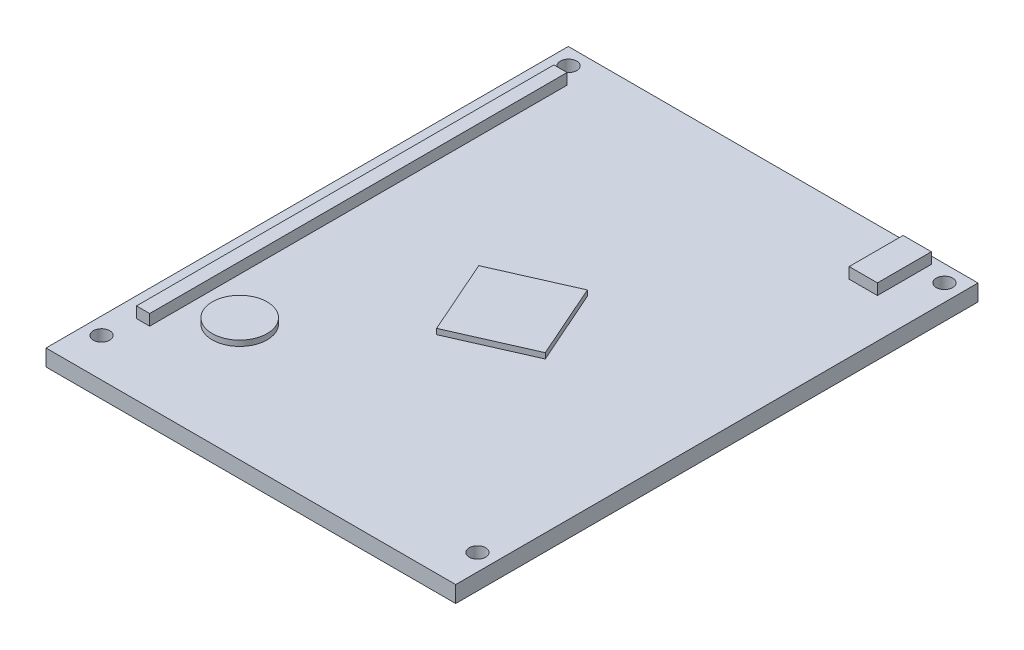
ISO-10303-21;
HEADER;
FILE_DESCRIPTION(('STEP AP214'),'2;1');
FILE_NAME('part.step','',(''),(''),'','','');
FILE_SCHEMA(('AUTOMOTIVE_DESIGN { 1 0 10303 214 1 1 1 1 }'));
ENDSEC;
DATA;
#1=APPLICATION_CONTEXT('core data for automotive mechanical design processes');
#2=APPLICATION_PROTOCOL_DEFINITION('international standard','automotive_design',2000,#1);
#3=PRODUCT_CONTEXT('',#1,'mechanical');
#4=PRODUCT('Part','Part','',(#3));
#5=PRODUCT_RELATED_PRODUCT_CATEGORY('part','',(#4));
#6=PRODUCT_DEFINITION_FORMATION('','',#4);
#7=PRODUCT_DEFINITION_CONTEXT('part definition',#1,'design');
#8=PRODUCT_DEFINITION('design','',#6,#7);
#9=PRODUCT_DEFINITION_SHAPE('','',#8);
#10=(LENGTH_UNIT() NAMED_UNIT(*) SI_UNIT(.MILLI.,.METRE.));
#11=(NAMED_UNIT(*) PLANE_ANGLE_UNIT() SI_UNIT($,.RADIAN.));
#12=(NAMED_UNIT(*) SI_UNIT($,.STERADIAN.) SOLID_ANGLE_UNIT());
#13=UNCERTAINTY_MEASURE_WITH_UNIT(LENGTH_MEASURE(1.E-05),#10,'distance_accuracy_value','');
#14=(GEOMETRIC_REPRESENTATION_CONTEXT(3) GLOBAL_UNCERTAINTY_ASSIGNED_CONTEXT((#13)) GLOBAL_UNIT_ASSIGNED_CONTEXT((#10,
#11,#12)) REPRESENTATION_CONTEXT('',''));
#15=CARTESIAN_POINT('',(0.,0.,0.));
#16=DIRECTION('',(0.,0.,1.));
#17=DIRECTION('',(1.,0.,0.));
#18=AXIS2_PLACEMENT_3D('',#15,#16,#17);
#19=CARTESIAN_POINT('',(0.,3.,0.));
#20=DIRECTION('',(0.,1.,0.));
#21=DIRECTION('',(0.,0.,1.));
#22=AXIS2_PLACEMENT_3D('',#19,#20,#21);
#23=PLANE('',#22);
#24=DIRECTION('',(-1.,0.,0.));
#25=VECTOR('',#24,1.);
#26=CARTESIAN_POINT('',(-33.7,3.,-41.3254575956985));
#27=LINE('',#26,#25);
#28=CARTESIAN_POINT('',(-31.3,3.,-41.3254575956985));
#29=VERTEX_POINT('',#28);
#30=CARTESIAN_POINT('',(-33.7,3.,-41.3254575956985));
#31=VERTEX_POINT('',#30);
#32=EDGE_CURVE('E177',#29,#31,#27,.T.);
#33=ORIENTED_EDGE('',*,*,#32,.F.);
#34=DIRECTION('',(0.,0.,-1.));
#35=VECTOR('',#34,1.);
#36=CARTESIAN_POINT('',(-31.3,3.,-41.3254575956985));
#37=LINE('',#36,#35);
#38=CARTESIAN_POINT('',(-31.3,3.,34.6745424043015));
#39=VERTEX_POINT('',#38);
#40=EDGE_CURVE('E174',#39,#29,#37,.T.);
#41=ORIENTED_EDGE('',*,*,#40,.F.);
#42=DIRECTION('',(1.,0.,0.));
#43=VECTOR('',#42,1.);
#44=CARTESIAN_POINT('',(-33.7,3.,34.6745424043015));
#45=LINE('',#44,#43);
#46=CARTESIAN_POINT('',(-33.7,3.,34.6745424043015));
#47=VERTEX_POINT('',#46);
#48=EDGE_CURVE('E186',#47,#39,#45,.T.);
#49=ORIENTED_EDGE('',*,*,#48,.F.);
#50=DIRECTION('',(0.,0.,1.));
#51=VECTOR('',#50,1.);
#52=CARTESIAN_POINT('',(-33.7,3.,-41.3254575956985));
#53=LINE('',#52,#51);
#54=EDGE_CURVE('E194',#31,#47,#53,.T.);
#55=ORIENTED_EDGE('',*,*,#54,.F.);
#56=EDGE_LOOP('',(#33,#41,#49,#55));
#57=FACE_BOUND('',#56,.T.);
#58=DIRECTION('',(0.40369535597845,0.,0.914893468968618));
#59=VECTOR('',#58,1.);
#60=CARTESIAN_POINT('',(-9.88941618710301,3.,-3.83398584742626));
#61=LINE('',#60,#59);
#62=CARTESIAN_POINT('',(-9.88941618710301,3.,-3.83398584742626));
#63=VERTEX_POINT('',#62);
#64=CARTESIAN_POINT('',(-3.83398584742626,3.,9.88941618710302));
#65=VERTEX_POINT('',#64);
#66=EDGE_CURVE('E225',#63,#65,#61,.T.);
#67=ORIENTED_EDGE('',*,*,#66,.F.);
#68=DIRECTION('',(-0.914893468968618,0.,0.40369535597845));
#69=VECTOR('',#68,1.);
#70=CARTESIAN_POINT('',(-9.88941618710301,3.,-3.83398584742626));
#71=LINE('',#70,#69);
#72=CARTESIAN_POINT('',(3.83398584742626,3.,-9.88941618710301));
#73=VERTEX_POINT('',#72);
#74=EDGE_CURVE('E209',#73,#63,#71,.T.);
#75=ORIENTED_EDGE('',*,*,#74,.F.);
#76=DIRECTION('',(-0.40369535597845,0.,-0.914893468968618));
#77=VECTOR('',#76,1.);
#78=CARTESIAN_POINT('',(3.83398584742626,3.,-9.88941618710301));
#79=LINE('',#78,#77);
#80=CARTESIAN_POINT('',(9.88941618710301,3.,3.83398584742626));
#81=VERTEX_POINT('',#80);
#82=EDGE_CURVE('E216',#81,#73,#79,.T.);
#83=ORIENTED_EDGE('',*,*,#82,.F.);
#84=DIRECTION('',(0.914893468968618,0.,-0.40369535597845));
#85=VECTOR('',#84,1.);
#86=CARTESIAN_POINT('',(-3.83398584742626,3.,9.88941618710302));
#87=LINE('',#86,#85);
#88=EDGE_CURVE('E227',#65,#81,#87,.T.);
#89=ORIENTED_EDGE('',*,*,#88,.F.);
#90=EDGE_LOOP('',(#67,#75,#83,#89));
#91=FACE_BOUND('',#90,.T.);
#92=CARTESIAN_POINT('',(34.225,3.,-44.515));
#93=DIRECTION('',(0.,1.,0.));
#94=DIRECTION('',(0.,0.,1.));
#95=AXIS2_PLACEMENT_3D('',#92,#93,#94);
#96=CIRCLE('',#95,1.5);
#97=CARTESIAN_POINT('',(34.225,3.,-43.015));
#98=VERTEX_POINT('',#97);
#99=EDGE_CURVE('E247',#98,#98,#96,.T.);
#100=ORIENTED_EDGE('',*,*,#99,.F.);
#101=EDGE_LOOP('',(#100));
#102=FACE_BOUND('',#101,.T.);
#103=CARTESIAN_POINT('',(-34.225,3.,40.515));
#104=DIRECTION('',(0.,1.,0.));
#105=DIRECTION('',(0.,0.,1.));
#106=AXIS2_PLACEMENT_3D('',#103,#104,#105);
#107=CIRCLE('',#106,1.5);
#108=CARTESIAN_POINT('',(-34.225,3.,42.015));
#109=VERTEX_POINT('',#108);
#110=EDGE_CURVE('E259',#109,#109,#107,.T.);
#111=ORIENTED_EDGE('',*,*,#110,.F.);
#112=EDGE_LOOP('',(#111));
#113=FACE_BOUND('',#112,.T.);
#114=DIRECTION('',(0.,0.,-1.));
#115=VECTOR('',#114,1.);
#116=CARTESIAN_POINT('',(37.3,3.,-47.55));
#117=LINE('',#116,#115);
#118=CARTESIAN_POINT('',(37.3,3.,47.55));
#119=VERTEX_POINT('',#118);
#120=CARTESIAN_POINT('',(37.3,3.,-47.55));
#121=VERTEX_POINT('',#120);
#122=EDGE_CURVE('E265',#119,#121,#117,.T.);
#123=ORIENTED_EDGE('',*,*,#122,.T.);
#124=DIRECTION('',(-1.,0.,0.));
#125=VECTOR('',#124,1.);
#126=CARTESIAN_POINT('',(-37.3,3.,-47.55));
#127=LINE('',#126,#125);
#128=CARTESIAN_POINT('',(-37.3,3.,-47.55));
#129=VERTEX_POINT('',#128);
#130=EDGE_CURVE('E268',#121,#129,#127,.T.);
#131=ORIENTED_EDGE('',*,*,#130,.T.);
#132=DIRECTION('',(0.,0.,1.));
#133=VECTOR('',#132,1.);
#134=CARTESIAN_POINT('',(-37.3,3.,-47.55));
#135=LINE('',#134,#133);
#136=CARTESIAN_POINT('',(-37.3,3.,47.55));
#137=VERTEX_POINT('',#136);
#138=EDGE_CURVE('E271',#129,#137,#135,.T.);
#139=ORIENTED_EDGE('',*,*,#138,.T.);
#140=DIRECTION('',(1.,0.,0.));
#141=VECTOR('',#140,1.);
#142=CARTESIAN_POINT('',(-37.3,3.,47.55));
#143=LINE('',#142,#141);
#144=EDGE_CURVE('E273',#137,#119,#143,.T.);
#145=ORIENTED_EDGE('',*,*,#144,.T.);
#146=EDGE_LOOP('',(#123,#131,#139,#145));
#147=FACE_BOUND('',#146,.T.);
#148=CARTESIAN_POINT('',(-34.225,3.,-44.515));
#149=DIRECTION('',(0.,1.,0.));
#150=DIRECTION('',(0.,0.,1.));
#151=AXIS2_PLACEMENT_3D('',#148,#149,#150);
#152=CIRCLE('',#151,1.5);
#153=CARTESIAN_POINT('',(-34.225,3.,-43.015));
#154=VERTEX_POINT('',#153);
#155=EDGE_CURVE('E253',#154,#154,#152,.T.);
#156=ORIENTED_EDGE('',*,*,#155,.F.);
#157=EDGE_LOOP('',(#156));
#158=FACE_BOUND('',#157,.T.);
#159=CARTESIAN_POINT('',(34.225,3.,40.515));
#160=DIRECTION('',(0.,1.,0.));
#161=DIRECTION('',(0.,0.,1.));
#162=AXIS2_PLACEMENT_3D('',#159,#160,#161);
#163=CIRCLE('',#162,1.5);
#164=CARTESIAN_POINT('',(34.225,3.,42.015));
#165=VERTEX_POINT('',#164);
#166=EDGE_CURVE('E241',#165,#165,#163,.T.);
#167=ORIENTED_EDGE('',*,*,#166,.F.);
#168=EDGE_LOOP('',(#167));
#169=FACE_BOUND('',#168,.T.);
#170=CARTESIAN_POINT('',(-23.4406590913058,3.,26.1402855596865));
#171=DIRECTION('',(0.,1.,0.));
#172=DIRECTION('',(0.,0.,1.));
#173=AXIS2_PLACEMENT_3D('',#170,#171,#172);
#174=CIRCLE('',#173,5.);
#175=CARTESIAN_POINT('',(-23.4406590913058,3.,31.1402855596865));
#176=VERTEX_POINT('',#175);
#177=EDGE_CURVE('E205',#176,#176,#174,.T.);
#178=ORIENTED_EDGE('',*,*,#177,.F.);
#179=EDGE_LOOP('',(#178));
#180=FACE_BOUND('',#179,.T.);
#181=DIRECTION('',(-1.,0.,0.));
#182=VECTOR('',#181,1.);
#183=CARTESIAN_POINT('',(24.9785951751988,3.,-46.2356199731953));
#184=LINE('',#183,#182);
#185=CARTESIAN_POINT('',(30.1215528838341,3.,-46.2356199731953));
#186=VERTEX_POINT('',#185);
#187=CARTESIAN_POINT('',(24.9785951751988,3.,-46.2356199731953));
#188=VERTEX_POINT('',#187);
#189=EDGE_CURVE('E575',#186,#188,#184,.T.);
#190=ORIENTED_EDGE('',*,*,#189,.F.);
#191=DIRECTION('',(0.,0.,-1.));
#192=VECTOR('',#191,1.);
#193=CARTESIAN_POINT('',(30.1215528838341,3.,-46.2356199731953));
#194=LINE('',#193,#192);
#195=CARTESIAN_POINT('',(30.1215528838341,3.,-36.4152952182017));
#196=VERTEX_POINT('',#195);
#197=EDGE_CURVE('E172',#196,#186,#194,.T.);
#198=ORIENTED_EDGE('',*,*,#197,.F.);
#199=DIRECTION('',(1.,0.,0.));
#200=VECTOR('',#199,1.);
#201=CARTESIAN_POINT('',(24.9785951751988,3.,-36.4152952182017));
#202=LINE('',#201,#200);
#203=CARTESIAN_POINT('',(24.9785951751988,3.,-36.4152952182017));
#204=VERTEX_POINT('',#203);
#205=EDGE_CURVE('E168',#204,#196,#202,.T.);
#206=ORIENTED_EDGE('',*,*,#205,.F.);
#207=DIRECTION('',(0.,0.,1.));
#208=VECTOR('',#207,1.);
#209=CARTESIAN_POINT('',(24.9785951751988,3.,-46.2356199731953));
#210=LINE('',#209,#208);
#211=EDGE_CURVE('E572',#188,#204,#210,.T.);
#212=ORIENTED_EDGE('',*,*,#211,.F.);
#213=EDGE_LOOP('',(#190,#198,#206,#212));
#214=FACE_BOUND('',#213,.T.);
#215=ADVANCED_FACE('F35',(#57,#91,#102,#113,#147,#158,#169,#180,#214),#23,.T.);
#216=CARTESIAN_POINT('',(0.,0.,0.));
#217=DIRECTION('',(0.,1.,0.));
#218=DIRECTION('',(0.,0.,1.));
#219=AXIS2_PLACEMENT_3D('',#216,#217,#218);
#220=PLANE('',#219);
#221=CARTESIAN_POINT('',(34.225,0.,-44.515));
#222=DIRECTION('',(0.,1.,0.));
#223=DIRECTION('',(0.,0.,1.));
#224=AXIS2_PLACEMENT_3D('',#221,#222,#223);
#225=CIRCLE('',#224,1.5);
#226=CARTESIAN_POINT('',(34.225,0.,-43.015));
#227=VERTEX_POINT('',#226);
#228=EDGE_CURVE('E244',#227,#227,#225,.T.);
#229=ORIENTED_EDGE('',*,*,#228,.T.);
#230=EDGE_LOOP('',(#229));
#231=FACE_BOUND('',#230,.T.);
#232=CARTESIAN_POINT('',(-34.225,0.,40.515));
#233=DIRECTION('',(0.,1.,0.));
#234=DIRECTION('',(0.,0.,1.));
#235=AXIS2_PLACEMENT_3D('',#232,#233,#234);
#236=CIRCLE('',#235,1.5);
#237=CARTESIAN_POINT('',(-34.225,0.,42.015));
#238=VERTEX_POINT('',#237);
#239=EDGE_CURVE('E256',#238,#238,#236,.T.);
#240=ORIENTED_EDGE('',*,*,#239,.T.);
#241=EDGE_LOOP('',(#240));
#242=FACE_BOUND('',#241,.T.);
#243=DIRECTION('',(0.,0.,-1.));
#244=VECTOR('',#243,1.);
#245=CARTESIAN_POINT('',(37.3,0.,-47.55));
#246=LINE('',#245,#244);
#247=CARTESIAN_POINT('',(37.3,0.,47.55));
#248=VERTEX_POINT('',#247);
#249=CARTESIAN_POINT('',(37.3,0.,-47.55));
#250=VERTEX_POINT('',#249);
#251=EDGE_CURVE('E262',#248,#250,#246,.T.);
#252=ORIENTED_EDGE('',*,*,#251,.F.);
#253=DIRECTION('',(1.,0.,0.));
#254=VECTOR('',#253,1.);
#255=CARTESIAN_POINT('',(-37.3,0.,47.55));
#256=LINE('',#255,#254);
#257=CARTESIAN_POINT('',(-37.3,0.,47.55));
#258=VERTEX_POINT('',#257);
#259=EDGE_CURVE('E269',#258,#248,#256,.T.);
#260=ORIENTED_EDGE('',*,*,#259,.F.);
#261=DIRECTION('',(0.,0.,1.));
#262=VECTOR('',#261,1.);
#263=CARTESIAN_POINT('',(-37.3,0.,-47.55));
#264=LINE('',#263,#262);
#265=CARTESIAN_POINT('',(-37.3,0.,-47.55));
#266=VERTEX_POINT('',#265);
#267=EDGE_CURVE('E280',#266,#258,#264,.T.);
#268=ORIENTED_EDGE('',*,*,#267,.F.);
#269=DIRECTION('',(-1.,0.,0.));
#270=VECTOR('',#269,1.);
#271=CARTESIAN_POINT('',(-37.3,0.,-47.55));
#272=LINE('',#271,#270);
#273=EDGE_CURVE('E278',#250,#266,#272,.T.);
#274=ORIENTED_EDGE('',*,*,#273,.F.);
#275=EDGE_LOOP('',(#252,#260,#268,#274));
#276=FACE_BOUND('',#275,.T.);
#277=CARTESIAN_POINT('',(-34.225,0.,-44.515));
#278=DIRECTION('',(0.,1.,0.));
#279=DIRECTION('',(0.,0.,1.));
#280=AXIS2_PLACEMENT_3D('',#277,#278,#279);
#281=CIRCLE('',#280,1.5);
#282=CARTESIAN_POINT('',(-34.225,0.,-43.015));
#283=VERTEX_POINT('',#282);
#284=EDGE_CURVE('E250',#283,#283,#281,.T.);
#285=ORIENTED_EDGE('',*,*,#284,.T.);
#286=EDGE_LOOP('',(#285));
#287=FACE_BOUND('',#286,.T.);
#288=CARTESIAN_POINT('',(34.225,0.,40.515));
#289=DIRECTION('',(0.,1.,0.));
#290=DIRECTION('',(0.,0.,1.));
#291=AXIS2_PLACEMENT_3D('',#288,#289,#290);
#292=CIRCLE('',#291,1.5);
#293=CARTESIAN_POINT('',(34.225,0.,42.015));
#294=VERTEX_POINT('',#293);
#295=EDGE_CURVE('E240',#294,#294,#292,.T.);
#296=ORIENTED_EDGE('',*,*,#295,.T.);
#297=EDGE_LOOP('',(#296));
#298=FACE_BOUND('',#297,.T.);
#299=ADVANCED_FACE('F298',(#231,#242,#276,#287,#298),#220,.F.);
#300=CARTESIAN_POINT('',(37.3,3.,-47.55));
#301=DIRECTION('',(-1.,0.,0.));
#302=DIRECTION('',(0.,0.,1.));
#303=AXIS2_PLACEMENT_3D('',#300,#301,#302);
#304=PLANE('',#303);
#305=ORIENTED_EDGE('',*,*,#251,.T.);
#306=DIRECTION('',(0.,-1.,0.));
#307=VECTOR('',#306,1.);
#308=CARTESIAN_POINT('',(37.3,3.,-47.55));
#309=LINE('',#308,#307);
#310=EDGE_CURVE('E11',#121,#250,#309,.T.);
#311=ORIENTED_EDGE('',*,*,#310,.F.);
#312=ORIENTED_EDGE('',*,*,#122,.F.);
#313=DIRECTION('',(0.,-1.,0.));
#314=VECTOR('',#313,1.);
#315=CARTESIAN_POINT('',(37.3,3.,47.55));
#316=LINE('',#315,#314);
#317=EDGE_CURVE('E275',#119,#248,#316,.T.);
#318=ORIENTED_EDGE('',*,*,#317,.T.);
#319=EDGE_LOOP('',(#305,#311,#312,#318));
#320=FACE_BOUND('',#319,.T.);
#321=ADVANCED_FACE('F37',(#320),#304,.F.);
#322=CARTESIAN_POINT('',(-37.3,3.,-47.55));
#323=DIRECTION('',(0.,0.,1.));
#324=DIRECTION('',(1.,0.,0.));
#325=AXIS2_PLACEMENT_3D('',#322,#323,#324);
#326=PLANE('',#325);
#327=ORIENTED_EDGE('',*,*,#273,.T.);
#328=DIRECTION('',(0.,-1.,0.));
#329=VECTOR('',#328,1.);
#330=CARTESIAN_POINT('',(-37.3,3.,-47.55));
#331=LINE('',#330,#329);
#332=EDGE_CURVE('E43',#129,#266,#331,.T.);
#333=ORIENTED_EDGE('',*,*,#332,.F.);
#334=ORIENTED_EDGE('',*,*,#130,.F.);
#335=ORIENTED_EDGE('',*,*,#310,.T.);
#336=EDGE_LOOP('',(#327,#333,#334,#335));
#337=FACE_BOUND('',#336,.T.);
#338=ADVANCED_FACE('F309',(#337),#326,.F.);
#339=CARTESIAN_POINT('',(-37.3,3.,-47.55));
#340=DIRECTION('',(1.,0.,0.));
#341=DIRECTION('',(0.,0.,-1.));
#342=AXIS2_PLACEMENT_3D('',#339,#340,#341);
#343=PLANE('',#342);
#344=ORIENTED_EDGE('',*,*,#267,.T.);
#345=DIRECTION('',(0.,-1.,0.));
#346=VECTOR('',#345,1.);
#347=CARTESIAN_POINT('',(-37.3,3.,47.55));
#348=LINE('',#347,#346);
#349=EDGE_CURVE('E285',#137,#258,#348,.T.);
#350=ORIENTED_EDGE('',*,*,#349,.F.);
#351=ORIENTED_EDGE('',*,*,#138,.F.);
#352=ORIENTED_EDGE('',*,*,#332,.T.);
#353=EDGE_LOOP('',(#344,#350,#351,#352));
#354=FACE_BOUND('',#353,.T.);
#355=ADVANCED_FACE('F292',(#354),#343,.F.);
#356=CARTESIAN_POINT('',(-37.3,3.,47.55));
#357=DIRECTION('',(0.,0.,-1.));
#358=DIRECTION('',(-1.,0.,0.));
#359=AXIS2_PLACEMENT_3D('',#356,#357,#358);
#360=PLANE('',#359);
#361=ORIENTED_EDGE('',*,*,#259,.T.);
#362=ORIENTED_EDGE('',*,*,#317,.F.);
#363=ORIENTED_EDGE('',*,*,#144,.F.);
#364=ORIENTED_EDGE('',*,*,#349,.T.);
#365=EDGE_LOOP('',(#361,#362,#363,#364));
#366=FACE_BOUND('',#365,.T.);
#367=ADVANCED_FACE('F302',(#366),#360,.F.);
#368=CARTESIAN_POINT('',(-34.225,3.,40.515));
#369=DIRECTION('',(0.,-1.,0.));
#370=DIRECTION('',(0.,0.,-1.));
#371=AXIS2_PLACEMENT_3D('',#368,#369,#370);
#372=CYLINDRICAL_SURFACE('',#371,1.5);
#373=ORIENTED_EDGE('',*,*,#110,.T.);
#374=EDGE_LOOP('',(#373));
#375=FACE_BOUND('',#374,.T.);
#376=ORIENTED_EDGE('',*,*,#239,.F.);
#377=EDGE_LOOP('',(#376));
#378=FACE_BOUND('',#377,.T.);
#379=ADVANCED_FACE('F327',(#375,#378),#372,.F.);
#380=CARTESIAN_POINT('',(-34.225,3.,-44.515));
#381=DIRECTION('',(0.,-1.,0.));
#382=DIRECTION('',(0.,0.,-1.));
#383=AXIS2_PLACEMENT_3D('',#380,#381,#382);
#384=CYLINDRICAL_SURFACE('',#383,1.5);
#385=ORIENTED_EDGE('',*,*,#155,.T.);
#386=EDGE_LOOP('',(#385));
#387=FACE_BOUND('',#386,.T.);
#388=ORIENTED_EDGE('',*,*,#284,.F.);
#389=EDGE_LOOP('',(#388));
#390=FACE_BOUND('',#389,.T.);
#391=ADVANCED_FACE('F334',(#387,#390),#384,.F.);
#392=CARTESIAN_POINT('',(34.225,3.,-44.515));
#393=DIRECTION('',(0.,-1.,0.));
#394=DIRECTION('',(0.,0.,-1.));
#395=AXIS2_PLACEMENT_3D('',#392,#393,#394);
#396=CYLINDRICAL_SURFACE('',#395,1.5);
#397=ORIENTED_EDGE('',*,*,#99,.T.);
#398=EDGE_LOOP('',(#397));
#399=FACE_BOUND('',#398,.T.);
#400=ORIENTED_EDGE('',*,*,#228,.F.);
#401=EDGE_LOOP('',(#400));
#402=FACE_BOUND('',#401,.T.);
#403=ADVANCED_FACE('F339',(#399,#402),#396,.F.);
#404=CARTESIAN_POINT('',(34.225,3.,40.515));
#405=DIRECTION('',(0.,-1.,0.));
#406=DIRECTION('',(0.,0.,-1.));
#407=AXIS2_PLACEMENT_3D('',#404,#405,#406);
#408=CYLINDRICAL_SURFACE('',#407,1.5);
#409=ORIENTED_EDGE('',*,*,#166,.T.);
#410=EDGE_LOOP('',(#409));
#411=FACE_BOUND('',#410,.T.);
#412=ORIENTED_EDGE('',*,*,#295,.F.);
#413=EDGE_LOOP('',(#412));
#414=FACE_BOUND('',#413,.T.);
#415=ADVANCED_FACE('F349',(#411,#414),#408,.F.);
#416=CARTESIAN_POINT('',(-9.88941618710301,4.,-3.83398584742626));
#417=DIRECTION('',(0.40369535597845,0.,0.914893468968618));
#418=DIRECTION('',(0.914893468968618,0.,-0.40369535597845));
#419=AXIS2_PLACEMENT_3D('',#416,#417,#418);
#420=PLANE('',#419);
#421=ORIENTED_EDGE('',*,*,#74,.T.);
#422=DIRECTION('',(0.,-1.,0.));
#423=VECTOR('',#422,1.);
#424=CARTESIAN_POINT('',(-9.88941618710301,4.,-3.83398584742626));
#425=LINE('',#424,#423);
#426=CARTESIAN_POINT('',(-9.88941618710301,4.,-3.83398584742626));
#427=VERTEX_POINT('',#426);
#428=EDGE_CURVE('E238',#427,#63,#425,.T.);
#429=ORIENTED_EDGE('',*,*,#428,.F.);
#430=DIRECTION('',(-0.914893468968618,0.,0.40369535597845));
#431=VECTOR('',#430,1.);
#432=CARTESIAN_POINT('',(-9.88941618710301,4.,-3.83398584742626));
#433=LINE('',#432,#431);
#434=CARTESIAN_POINT('',(3.83398584742626,4.,-9.88941618710301));
#435=VERTEX_POINT('',#434);
#436=EDGE_CURVE('E212',#435,#427,#433,.T.);
#437=ORIENTED_EDGE('',*,*,#436,.F.);
#438=DIRECTION('',(0.,-1.,0.));
#439=VECTOR('',#438,1.);
#440=CARTESIAN_POINT('',(3.83398584742626,4.,-9.88941618710301));
#441=LINE('',#440,#439);
#442=EDGE_CURVE('E222',#435,#73,#441,.T.);
#443=ORIENTED_EDGE('',*,*,#442,.T.);
#444=EDGE_LOOP('',(#421,#429,#437,#443));
#445=FACE_BOUND('',#444,.T.);
#446=ADVANCED_FACE('F356',(#445),#420,.F.);
#447=CARTESIAN_POINT('',(-9.88941618710301,4.,-3.83398584742626));
#448=DIRECTION('',(0.914893468968618,0.,-0.40369535597845));
#449=DIRECTION('',(-0.40369535597845,0.,-0.914893468968619));
#450=AXIS2_PLACEMENT_3D('',#447,#448,#449);
#451=PLANE('',#450);
#452=ORIENTED_EDGE('',*,*,#66,.T.);
#453=DIRECTION('',(0.,-1.,0.));
#454=VECTOR('',#453,1.);
#455=CARTESIAN_POINT('',(-3.83398584742626,4.,9.88941618710302));
#456=LINE('',#455,#454);
#457=CARTESIAN_POINT('',(-3.83398584742626,4.,9.88941618710302));
#458=VERTEX_POINT('',#457);
#459=EDGE_CURVE('E235',#458,#65,#456,.T.);
#460=ORIENTED_EDGE('',*,*,#459,.F.);
#461=DIRECTION('',(0.40369535597845,0.,0.914893468968618));
#462=VECTOR('',#461,1.);
#463=CARTESIAN_POINT('',(-9.88941618710301,4.,-3.83398584742626));
#464=LINE('',#463,#462);
#465=EDGE_CURVE('E215',#427,#458,#464,.T.);
#466=ORIENTED_EDGE('',*,*,#465,.F.);
#467=ORIENTED_EDGE('',*,*,#428,.T.);
#468=EDGE_LOOP('',(#452,#460,#466,#467));
#469=FACE_BOUND('',#468,.T.);
#470=ADVANCED_FACE('F360',(#469),#451,.F.);
#471=CARTESIAN_POINT('',(-3.83398584742626,4.,9.88941618710302));
#472=DIRECTION('',(-0.40369535597845,0.,-0.914893468968618));
#473=DIRECTION('',(-0.914893468968618,0.,0.40369535597845));
#474=AXIS2_PLACEMENT_3D('',#471,#472,#473);
#475=PLANE('',#474);
#476=ORIENTED_EDGE('',*,*,#88,.T.);
#477=DIRECTION('',(0.,-1.,0.));
#478=VECTOR('',#477,1.);
#479=CARTESIAN_POINT('',(9.88941618710301,4.,3.83398584742626));
#480=LINE('',#479,#478);
#481=CARTESIAN_POINT('',(9.88941618710301,4.,3.83398584742626));
#482=VERTEX_POINT('',#481);
#483=EDGE_CURVE('E233',#482,#81,#480,.T.);
#484=ORIENTED_EDGE('',*,*,#483,.F.);
#485=DIRECTION('',(0.914893468968618,0.,-0.40369535597845));
#486=VECTOR('',#485,1.);
#487=CARTESIAN_POINT('',(-3.83398584742626,4.,9.88941618710302));
#488=LINE('',#487,#486);
#489=EDGE_CURVE('E218',#458,#482,#488,.T.);
#490=ORIENTED_EDGE('',*,*,#489,.F.);
#491=ORIENTED_EDGE('',*,*,#459,.T.);
#492=EDGE_LOOP('',(#476,#484,#490,#491));
#493=FACE_BOUND('',#492,.T.);
#494=ADVANCED_FACE('F364',(#493),#475,.F.);
#495=CARTESIAN_POINT('',(3.83398584742626,4.,-9.88941618710301));
#496=DIRECTION('',(-0.914893468968618,0.,0.40369535597845));
#497=DIRECTION('',(0.40369535597845,0.,0.914893468968619));
#498=AXIS2_PLACEMENT_3D('',#495,#496,#497);
#499=PLANE('',#498);
#500=ORIENTED_EDGE('',*,*,#82,.T.);
#501=ORIENTED_EDGE('',*,*,#442,.F.);
#502=DIRECTION('',(-0.40369535597845,0.,-0.914893468968618));
#503=VECTOR('',#502,1.);
#504=CARTESIAN_POINT('',(3.83398584742626,4.,-9.88941618710301));
#505=LINE('',#504,#503);
#506=EDGE_CURVE('E220',#482,#435,#505,.T.);
#507=ORIENTED_EDGE('',*,*,#506,.F.);
#508=ORIENTED_EDGE('',*,*,#483,.T.);
#509=EDGE_LOOP('',(#500,#501,#507,#508));
#510=FACE_BOUND('',#509,.T.);
#511=ADVANCED_FACE('F368',(#510),#499,.F.);
#512=CARTESIAN_POINT('',(0.,4.,0.));
#513=DIRECTION('',(0.,-1.,0.));
#514=DIRECTION('',(0.,0.,-1.));
#515=AXIS2_PLACEMENT_3D('',#512,#513,#514);
#516=PLANE('',#515);
#517=ORIENTED_EDGE('',*,*,#436,.T.);
#518=ORIENTED_EDGE('',*,*,#465,.T.);
#519=ORIENTED_EDGE('',*,*,#489,.T.);
#520=ORIENTED_EDGE('',*,*,#506,.T.);
#521=EDGE_LOOP('',(#517,#518,#519,#520));
#522=FACE_BOUND('',#521,.T.);
#523=ADVANCED_FACE('F372',(#522),#516,.F.);
#524=CARTESIAN_POINT('',(-23.4406590913058,4.,26.1402855596865));
#525=DIRECTION('',(0.,-1.,0.));
#526=DIRECTION('',(0.,0.,-1.));
#527=AXIS2_PLACEMENT_3D('',#524,#525,#526);
#528=CYLINDRICAL_SURFACE('',#527,5.);
#529=CARTESIAN_POINT('',(-23.4406590913058,4.,26.1402855596865));
#530=DIRECTION('',(0.,1.,0.));
#531=DIRECTION('',(0.,0.,1.));
#532=AXIS2_PLACEMENT_3D('',#529,#530,#531);
#533=CIRCLE('',#532,5.);
#534=CARTESIAN_POINT('',(-23.4406590913058,4.,31.1402855596865));
#535=VERTEX_POINT('',#534);
#536=EDGE_CURVE('E206',#535,#535,#533,.T.);
#537=ORIENTED_EDGE('',*,*,#536,.F.);
#538=EDGE_LOOP('',(#537));
#539=FACE_BOUND('',#538,.T.);
#540=ORIENTED_EDGE('',*,*,#177,.T.);
#541=EDGE_LOOP('',(#540));
#542=FACE_BOUND('',#541,.T.);
#543=ADVANCED_FACE('F376',(#539,#542),#528,.T.);
#544=CARTESIAN_POINT('',(-23.4406590913058,4.,26.1402855596865));
#545=DIRECTION('',(0.,1.,0.));
#546=DIRECTION('',(0.,0.,1.));
#547=AXIS2_PLACEMENT_3D('',#544,#545,#546);
#548=PLANE('',#547);
#549=ORIENTED_EDGE('',*,*,#536,.T.);
#550=EDGE_LOOP('',(#549));
#551=FACE_BOUND('',#550,.T.);
#552=ADVANCED_FACE('F380',(#551),#548,.T.);
#553=CARTESIAN_POINT('',(-31.3,5.,-41.3254575956985));
#554=DIRECTION('',(-1.,0.,0.));
#555=DIRECTION('',(0.,0.,1.));
#556=AXIS2_PLACEMENT_3D('',#553,#554,#555);
#557=PLANE('',#556);
#558=ORIENTED_EDGE('',*,*,#40,.T.);
#559=DIRECTION('',(0.,-1.,0.));
#560=VECTOR('',#559,1.);
#561=CARTESIAN_POINT('',(-31.3,5.,-41.3254575956985));
#562=LINE('',#561,#560);
#563=CARTESIAN_POINT('',(-31.3,5.,-41.3254575956985));
#564=VERTEX_POINT('',#563);
#565=EDGE_CURVE('E203',#564,#29,#562,.T.);
#566=ORIENTED_EDGE('',*,*,#565,.F.);
#567=DIRECTION('',(0.,0.,-1.));
#568=VECTOR('',#567,1.);
#569=CARTESIAN_POINT('',(-31.3,5.,-41.3254575956985));
#570=LINE('',#569,#568);
#571=CARTESIAN_POINT('',(-31.3,5.,34.6745424043015));
#572=VERTEX_POINT('',#571);
#573=EDGE_CURVE('E182',#572,#564,#570,.T.);
#574=ORIENTED_EDGE('',*,*,#573,.F.);
#575=DIRECTION('',(0.,-1.,0.));
#576=VECTOR('',#575,1.);
#577=CARTESIAN_POINT('',(-31.3,5.,34.6745424043015));
#578=LINE('',#577,#576);
#579=EDGE_CURVE('E191',#572,#39,#578,.T.);
#580=ORIENTED_EDGE('',*,*,#579,.T.);
#581=EDGE_LOOP('',(#558,#566,#574,#580));
#582=FACE_BOUND('',#581,.T.);
#583=ADVANCED_FACE('F384',(#582),#557,.F.);
#584=CARTESIAN_POINT('',(-33.7,5.,-41.3254575956985));
#585=DIRECTION('',(0.,0.,1.));
#586=DIRECTION('',(1.,0.,0.));
#587=AXIS2_PLACEMENT_3D('',#584,#585,#586);
#588=PLANE('',#587);
#589=ORIENTED_EDGE('',*,*,#32,.T.);
#590=DIRECTION('',(0.,-1.,0.));
#591=VECTOR('',#590,1.);
#592=CARTESIAN_POINT('',(-33.7,5.,-41.3254575956985));
#593=LINE('',#592,#591);
#594=CARTESIAN_POINT('',(-33.7,5.,-41.3254575956985));
#595=VERTEX_POINT('',#594);
#596=EDGE_CURVE('E200',#595,#31,#593,.T.);
#597=ORIENTED_EDGE('',*,*,#596,.F.);
#598=DIRECTION('',(-1.,0.,0.));
#599=VECTOR('',#598,1.);
#600=CARTESIAN_POINT('',(-33.7,5.,-41.3254575956985));
#601=LINE('',#600,#599);
#602=EDGE_CURVE('E185',#564,#595,#601,.T.);
#603=ORIENTED_EDGE('',*,*,#602,.F.);
#604=ORIENTED_EDGE('',*,*,#565,.T.);
#605=EDGE_LOOP('',(#589,#597,#603,#604));
#606=FACE_BOUND('',#605,.T.);
#607=ADVANCED_FACE('F388',(#606),#588,.F.);
#608=CARTESIAN_POINT('',(-33.7,5.,-41.3254575956985));
#609=DIRECTION('',(1.,0.,0.));
#610=DIRECTION('',(0.,0.,-1.));
#611=AXIS2_PLACEMENT_3D('',#608,#609,#610);
#612=PLANE('',#611);
#613=ORIENTED_EDGE('',*,*,#54,.T.);
#614=DIRECTION('',(0.,-1.,0.));
#615=VECTOR('',#614,1.);
#616=CARTESIAN_POINT('',(-33.7,5.,34.6745424043015));
#617=LINE('',#616,#615);
#618=CARTESIAN_POINT('',(-33.7,5.,34.6745424043015));
#619=VERTEX_POINT('',#618);
#620=EDGE_CURVE('E58',#619,#47,#617,.T.);
#621=ORIENTED_EDGE('',*,*,#620,.F.);
#622=DIRECTION('',(0.,0.,1.));
#623=VECTOR('',#622,1.);
#624=CARTESIAN_POINT('',(-33.7,5.,-41.3254575956985));
#625=LINE('',#624,#623);
#626=EDGE_CURVE('E188',#595,#619,#625,.T.);
#627=ORIENTED_EDGE('',*,*,#626,.F.);
#628=ORIENTED_EDGE('',*,*,#596,.T.);
#629=EDGE_LOOP('',(#613,#621,#627,#628));
#630=FACE_BOUND('',#629,.T.);
#631=ADVANCED_FACE('F392',(#630),#612,.F.);
#632=CARTESIAN_POINT('',(-33.7,5.,34.6745424043015));
#633=DIRECTION('',(0.,0.,-1.));
#634=DIRECTION('',(-1.,0.,0.));
#635=AXIS2_PLACEMENT_3D('',#632,#633,#634);
#636=PLANE('',#635);
#637=ORIENTED_EDGE('',*,*,#48,.T.);
#638=ORIENTED_EDGE('',*,*,#579,.F.);
#639=DIRECTION('',(1.,0.,0.));
#640=VECTOR('',#639,1.);
#641=CARTESIAN_POINT('',(-33.7,5.,34.6745424043015));
#642=LINE('',#641,#640);
#643=EDGE_CURVE('E190',#619,#572,#642,.T.);
#644=ORIENTED_EDGE('',*,*,#643,.F.);
#645=ORIENTED_EDGE('',*,*,#620,.T.);
#646=EDGE_LOOP('',(#637,#638,#644,#645));
#647=FACE_BOUND('',#646,.T.);
#648=ADVANCED_FACE('F396',(#647),#636,.F.);
#649=CARTESIAN_POINT('',(0.,5.,0.));
#650=DIRECTION('',(0.,1.,0.));
#651=DIRECTION('',(0.,0.,1.));
#652=AXIS2_PLACEMENT_3D('',#649,#650,#651);
#653=PLANE('',#652);
#654=ORIENTED_EDGE('',*,*,#573,.T.);
#655=ORIENTED_EDGE('',*,*,#602,.T.);
#656=ORIENTED_EDGE('',*,*,#626,.T.);
#657=ORIENTED_EDGE('',*,*,#643,.T.);
#658=EDGE_LOOP('',(#654,#655,#656,#657));
#659=FACE_BOUND('',#658,.T.);
#660=ADVANCED_FACE('F400',(#659),#653,.T.);
#661=CARTESIAN_POINT('',(30.1215528838341,5.,-46.2356199731953));
#662=DIRECTION('',(-1.,0.,0.));
#663=DIRECTION('',(0.,0.,1.));
#664=AXIS2_PLACEMENT_3D('',#661,#662,#663);
#665=PLANE('',#664);
#666=ORIENTED_EDGE('',*,*,#197,.T.);
#667=DIRECTION('',(0.,-1.,0.));
#668=VECTOR('',#667,1.);
#669=CARTESIAN_POINT('',(30.1215528838341,5.,-46.2356199731953));
#670=LINE('',#669,#668);
#671=CARTESIAN_POINT('',(30.1215528838341,5.,-46.2356199731953));
#672=VERTEX_POINT('',#671);
#673=EDGE_CURVE('E153',#672,#186,#670,.T.);
#674=ORIENTED_EDGE('',*,*,#673,.F.);
#675=DIRECTION('',(0.,0.,-1.));
#676=VECTOR('',#675,1.);
#677=CARTESIAN_POINT('',(30.1215528838341,5.,-46.2356199731953));
#678=LINE('',#677,#676);
#679=CARTESIAN_POINT('',(30.1215528838341,5.,-36.4152952182017));
#680=VERTEX_POINT('',#679);
#681=EDGE_CURVE('E160',#680,#672,#678,.T.);
#682=ORIENTED_EDGE('',*,*,#681,.F.);
#683=DIRECTION('',(0.,-1.,0.));
#684=VECTOR('',#683,1.);
#685=CARTESIAN_POINT('',(30.1215528838341,5.,-36.4152952182017));
#686=LINE('',#685,#684);
#687=EDGE_CURVE('E569',#680,#196,#686,.T.);
#688=ORIENTED_EDGE('',*,*,#687,.T.);
#689=EDGE_LOOP('',(#666,#674,#682,#688));
#690=FACE_BOUND('',#689,.T.);
#691=ADVANCED_FACE('F170',(#690),#665,.F.);
#692=CARTESIAN_POINT('',(24.9785951751988,5.,-46.2356199731953));
#693=DIRECTION('',(0.,0.,1.));
#694=DIRECTION('',(1.,0.,0.));
#695=AXIS2_PLACEMENT_3D('',#692,#693,#694);
#696=PLANE('',#695);
#697=ORIENTED_EDGE('',*,*,#189,.T.);
#698=DIRECTION('',(0.,-1.,0.));
#699=VECTOR('',#698,1.);
#700=CARTESIAN_POINT('',(24.9785951751988,5.,-46.2356199731953));
#701=LINE('',#700,#699);
#702=CARTESIAN_POINT('',(24.9785951751988,5.,-46.2356199731953));
#703=VERTEX_POINT('',#702);
#704=EDGE_CURVE('E156',#703,#188,#701,.T.);
#705=ORIENTED_EDGE('',*,*,#704,.F.);
#706=DIRECTION('',(-1.,0.,0.));
#707=VECTOR('',#706,1.);
#708=CARTESIAN_POINT('',(24.9785951751988,5.,-46.2356199731953));
#709=LINE('',#708,#707);
#710=EDGE_CURVE('E149',#672,#703,#709,.T.);
#711=ORIENTED_EDGE('',*,*,#710,.F.);
#712=ORIENTED_EDGE('',*,*,#673,.T.);
#713=EDGE_LOOP('',(#697,#705,#711,#712));
#714=FACE_BOUND('',#713,.T.);
#715=ADVANCED_FACE('F151',(#714),#696,.F.);
#716=CARTESIAN_POINT('',(24.9785951751988,5.,-46.2356199731953));
#717=DIRECTION('',(1.,0.,0.));
#718=DIRECTION('',(0.,0.,-1.));
#719=AXIS2_PLACEMENT_3D('',#716,#717,#718);
#720=PLANE('',#719);
#721=ORIENTED_EDGE('',*,*,#211,.T.);
#722=DIRECTION('',(0.,-1.,0.));
#723=VECTOR('',#722,1.);
#724=CARTESIAN_POINT('',(24.9785951751988,5.,-36.4152952182017));
#725=LINE('',#724,#723);
#726=CARTESIAN_POINT('',(24.9785951751988,5.,-36.4152952182017));
#727=VERTEX_POINT('',#726);
#728=EDGE_CURVE('E50',#727,#204,#725,.T.);
#729=ORIENTED_EDGE('',*,*,#728,.F.);
#730=DIRECTION('',(0.,0.,1.));
#731=VECTOR('',#730,1.);
#732=CARTESIAN_POINT('',(24.9785951751988,5.,-46.2356199731953));
#733=LINE('',#732,#731);
#734=EDGE_CURVE('E159',#703,#727,#733,.T.);
#735=ORIENTED_EDGE('',*,*,#734,.F.);
#736=ORIENTED_EDGE('',*,*,#704,.T.);
#737=EDGE_LOOP('',(#721,#729,#735,#736));
#738=FACE_BOUND('',#737,.T.);
#739=ADVANCED_FACE('F408',(#738),#720,.F.);
#740=CARTESIAN_POINT('',(24.9785951751988,5.,-36.4152952182017));
#741=DIRECTION('',(0.,0.,-1.));
#742=DIRECTION('',(-1.,0.,0.));
#743=AXIS2_PLACEMENT_3D('',#740,#741,#742);
#744=PLANE('',#743);
#745=ORIENTED_EDGE('',*,*,#205,.T.);
#746=ORIENTED_EDGE('',*,*,#687,.F.);
#747=DIRECTION('',(1.,0.,0.));
#748=VECTOR('',#747,1.);
#749=CARTESIAN_POINT('',(24.9785951751988,5.,-36.4152952182017));
#750=LINE('',#749,#748);
#751=EDGE_CURVE('E164',#727,#680,#750,.T.);
#752=ORIENTED_EDGE('',*,*,#751,.F.);
#753=ORIENTED_EDGE('',*,*,#728,.T.);
#754=EDGE_LOOP('',(#745,#746,#752,#753));
#755=FACE_BOUND('',#754,.T.);
#756=ADVANCED_FACE('F411',(#755),#744,.F.);
#757=CARTESIAN_POINT('',(0.,5.,0.));
#758=DIRECTION('',(0.,1.,0.));
#759=DIRECTION('',(0.,0.,1.));
#760=AXIS2_PLACEMENT_3D('',#757,#758,#759);
#761=PLANE('',#760);
#762=ORIENTED_EDGE('',*,*,#681,.T.);
#763=ORIENTED_EDGE('',*,*,#710,.T.);
#764=ORIENTED_EDGE('',*,*,#734,.T.);
#765=ORIENTED_EDGE('',*,*,#751,.T.);
#766=EDGE_LOOP('',(#762,#763,#764,#765));
#767=FACE_BOUND('',#766,.T.);
#768=ADVANCED_FACE('F163',(#767),#761,.T.);
#769=CLOSED_SHELL('',(#215,#299,#321,#338,#355,#367,#379,#391,#403,#415,#446,#470,#494,#511,
#523,#543,#552,#583,#607,#631,#648,#660,#691,#715,#739,#756,#768));
#770=MANIFOLD_SOLID_BREP('B2',#769);
#771=ADVANCED_BREP_SHAPE_REPRESENTATION('',(#18,#770),#14);
#772=SHAPE_DEFINITION_REPRESENTATION(#9,#771);
ENDSEC;
END-ISO-10303-21;
